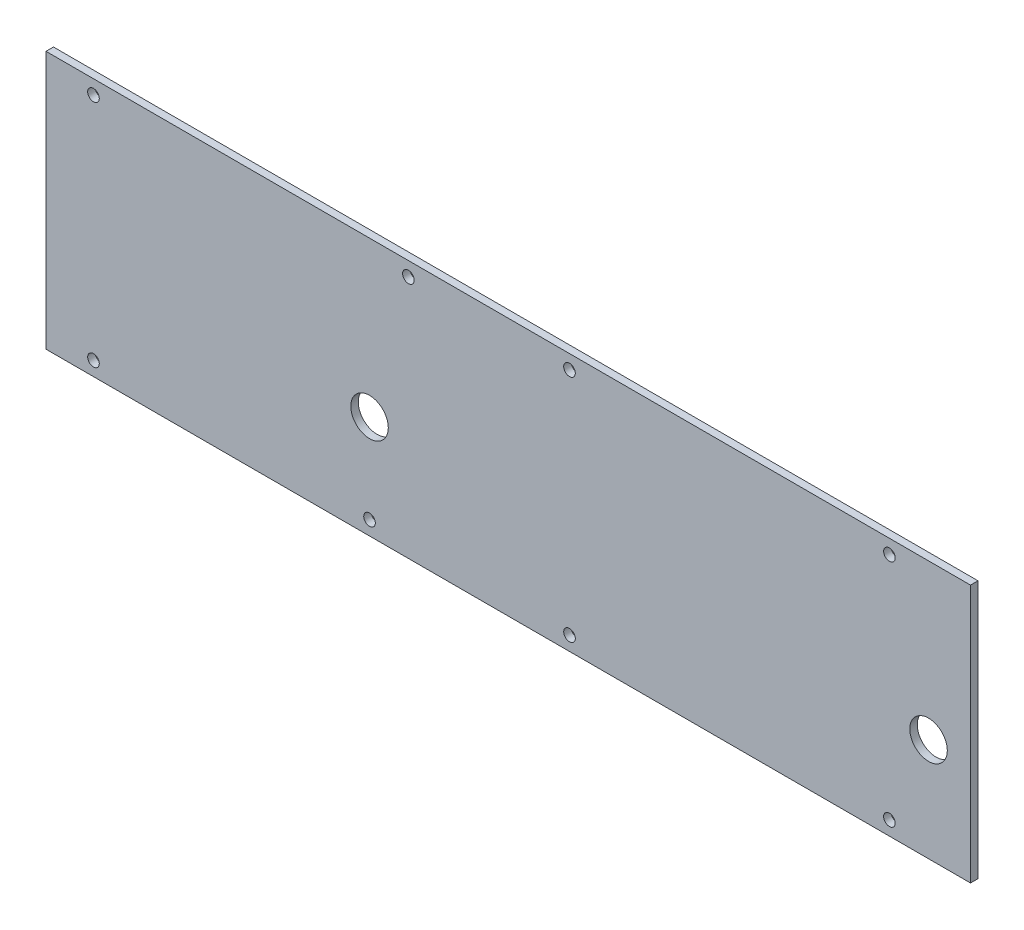
ISO-10303-21;
HEADER;
FILE_DESCRIPTION(('STEP AP214'),'2;1');
FILE_NAME('part.step','',(''),(''),'','','');
FILE_SCHEMA(('AUTOMOTIVE_DESIGN { 1 0 10303 214 1 1 1 1 }'));
ENDSEC;
DATA;
#1=APPLICATION_CONTEXT('core data for automotive mechanical design processes');
#2=APPLICATION_PROTOCOL_DEFINITION('international standard','automotive_design',2000,#1);
#3=PRODUCT_CONTEXT('',#1,'mechanical');
#4=PRODUCT('Part','Part','',(#3));
#5=PRODUCT_RELATED_PRODUCT_CATEGORY('part','',(#4));
#6=PRODUCT_DEFINITION_FORMATION('','',#4);
#7=PRODUCT_DEFINITION_CONTEXT('part definition',#1,'design');
#8=PRODUCT_DEFINITION('design','',#6,#7);
#9=PRODUCT_DEFINITION_SHAPE('','',#8);
#10=(LENGTH_UNIT() NAMED_UNIT(*) SI_UNIT(.MILLI.,.METRE.));
#11=(NAMED_UNIT(*) PLANE_ANGLE_UNIT() SI_UNIT($,.RADIAN.));
#12=(NAMED_UNIT(*) SI_UNIT($,.STERADIAN.) SOLID_ANGLE_UNIT());
#13=UNCERTAINTY_MEASURE_WITH_UNIT(LENGTH_MEASURE(1.E-05),#10,'distance_accuracy_value','');
#14=(GEOMETRIC_REPRESENTATION_CONTEXT(3) GLOBAL_UNCERTAINTY_ASSIGNED_CONTEXT((#13)) GLOBAL_UNIT_ASSIGNED_CONTEXT((#10,
#11,#12)) REPRESENTATION_CONTEXT('',''));
#15=CARTESIAN_POINT('',(0.,0.,0.));
#16=DIRECTION('',(0.,0.,1.));
#17=DIRECTION('',(1.,0.,0.));
#18=AXIS2_PLACEMENT_3D('',#15,#16,#17);
#19=CARTESIAN_POINT('',(136.525,38.1,-1.1049));
#20=DIRECTION('',(0.,1.,0.));
#21=DIRECTION('',(0.,0.,1.));
#22=AXIS2_PLACEMENT_3D('',#19,#20,#21);
#23=PLANE('',#22);
#24=DIRECTION('',(-1.,0.,0.));
#25=VECTOR('',#24,1.);
#26=CARTESIAN_POINT('',(136.525,38.1,1.1049));
#27=LINE('',#26,#25);
#28=CARTESIAN_POINT('',(136.525,38.1,1.1049));
#29=VERTEX_POINT('',#28);
#30=CARTESIAN_POINT('',(-136.525,38.1,1.1049));
#31=VERTEX_POINT('',#30);
#32=EDGE_CURVE('E97',#29,#31,#27,.T.);
#33=ORIENTED_EDGE('',*,*,#32,.F.);
#34=DIRECTION('',(0.,0.,1.));
#35=VECTOR('',#34,1.);
#36=CARTESIAN_POINT('',(136.525,38.1,-1.1049));
#37=LINE('',#36,#35);
#38=CARTESIAN_POINT('',(136.525,38.1,-1.1049));
#39=VERTEX_POINT('',#38);
#40=EDGE_CURVE('E11',#39,#29,#37,.T.);
#41=ORIENTED_EDGE('',*,*,#40,.F.);
#42=DIRECTION('',(-1.,0.,0.));
#43=VECTOR('',#42,1.);
#44=CARTESIAN_POINT('',(136.525,38.1,-1.1049));
#45=LINE('',#44,#43);
#46=CARTESIAN_POINT('',(-136.525,38.1,-1.1049));
#47=VERTEX_POINT('',#46);
#48=EDGE_CURVE('E90',#39,#47,#45,.T.);
#49=ORIENTED_EDGE('',*,*,#48,.T.);
#50=DIRECTION('',(0.,0.,1.));
#51=VECTOR('',#50,1.);
#52=CARTESIAN_POINT('',(-136.525,38.1,-1.1049));
#53=LINE('',#52,#51);
#54=EDGE_CURVE('E35',#47,#31,#53,.T.);
#55=ORIENTED_EDGE('',*,*,#54,.T.);
#56=EDGE_LOOP('',(#33,#41,#49,#55));
#57=FACE_BOUND('',#56,.T.);
#58=ADVANCED_FACE('F32',(#57),#23,.T.);
#59=CARTESIAN_POINT('',(136.525,-38.1,-1.1049));
#60=DIRECTION('',(1.,0.,0.));
#61=DIRECTION('',(0.,0.,-1.));
#62=AXIS2_PLACEMENT_3D('',#59,#60,#61);
#63=PLANE('',#62);
#64=DIRECTION('',(0.,1.,0.));
#65=VECTOR('',#64,1.);
#66=CARTESIAN_POINT('',(136.525,-38.1,1.1049));
#67=LINE('',#66,#65);
#68=CARTESIAN_POINT('',(136.525,-38.1,1.1049));
#69=VERTEX_POINT('',#68);
#70=EDGE_CURVE('E92',#69,#29,#67,.T.);
#71=ORIENTED_EDGE('',*,*,#70,.F.);
#72=DIRECTION('',(0.,0.,1.));
#73=VECTOR('',#72,1.);
#74=CARTESIAN_POINT('',(136.525,-38.1,-1.1049));
#75=LINE('',#74,#73);
#76=CARTESIAN_POINT('',(136.525,-38.1,-1.1049));
#77=VERTEX_POINT('',#76);
#78=EDGE_CURVE('E41',#77,#69,#75,.T.);
#79=ORIENTED_EDGE('',*,*,#78,.F.);
#80=DIRECTION('',(0.,1.,0.));
#81=VECTOR('',#80,1.);
#82=CARTESIAN_POINT('',(136.525,-38.1,-1.1049));
#83=LINE('',#82,#81);
#84=EDGE_CURVE('E87',#77,#39,#83,.T.);
#85=ORIENTED_EDGE('',*,*,#84,.T.);
#86=ORIENTED_EDGE('',*,*,#40,.T.);
#87=EDGE_LOOP('',(#71,#79,#85,#86));
#88=FACE_BOUND('',#87,.T.);
#89=ADVANCED_FACE('F108',(#88),#63,.T.);
#90=CARTESIAN_POINT('',(-136.525,-38.1,-1.1049));
#91=DIRECTION('',(0.,-1.,0.));
#92=DIRECTION('',(0.,0.,-1.));
#93=AXIS2_PLACEMENT_3D('',#90,#91,#92);
#94=PLANE('',#93);
#95=DIRECTION('',(1.,0.,0.));
#96=VECTOR('',#95,1.);
#97=CARTESIAN_POINT('',(-136.525,-38.1,1.1049));
#98=LINE('',#97,#96);
#99=CARTESIAN_POINT('',(-136.525,-38.1,1.1049));
#100=VERTEX_POINT('',#99);
#101=EDGE_CURVE('E82',#100,#69,#98,.T.);
#102=ORIENTED_EDGE('',*,*,#101,.F.);
#103=DIRECTION('',(0.,0.,1.));
#104=VECTOR('',#103,1.);
#105=CARTESIAN_POINT('',(-136.525,-38.1,-1.1049));
#106=LINE('',#105,#104);
#107=CARTESIAN_POINT('',(-136.525,-38.1,-1.1049));
#108=VERTEX_POINT('',#107);
#109=EDGE_CURVE('E77',#108,#100,#106,.T.);
#110=ORIENTED_EDGE('',*,*,#109,.F.);
#111=DIRECTION('',(1.,0.,0.));
#112=VECTOR('',#111,1.);
#113=CARTESIAN_POINT('',(-136.525,-38.1,-1.1049));
#114=LINE('',#113,#112);
#115=EDGE_CURVE('E80',#108,#77,#114,.T.);
#116=ORIENTED_EDGE('',*,*,#115,.T.);
#117=ORIENTED_EDGE('',*,*,#78,.T.);
#118=EDGE_LOOP('',(#102,#110,#116,#117));
#119=FACE_BOUND('',#118,.T.);
#120=ADVANCED_FACE('F79',(#119),#94,.T.);
#121=CARTESIAN_POINT('',(-136.525,38.1,-1.1049));
#122=DIRECTION('',(-1.,0.,0.));
#123=DIRECTION('',(0.,0.,1.));
#124=AXIS2_PLACEMENT_3D('',#121,#122,#123);
#125=PLANE('',#124);
#126=DIRECTION('',(0.,-1.,0.));
#127=VECTOR('',#126,1.);
#128=CARTESIAN_POINT('',(-136.525,38.1,1.1049));
#129=LINE('',#128,#127);
#130=EDGE_CURVE('E100',#31,#100,#129,.T.);
#131=ORIENTED_EDGE('',*,*,#130,.F.);
#132=ORIENTED_EDGE('',*,*,#54,.F.);
#133=DIRECTION('',(0.,-1.,0.));
#134=VECTOR('',#133,1.);
#135=CARTESIAN_POINT('',(-136.525,38.1,-1.1049));
#136=LINE('',#135,#134);
#137=EDGE_CURVE('E86',#47,#108,#136,.T.);
#138=ORIENTED_EDGE('',*,*,#137,.T.);
#139=ORIENTED_EDGE('',*,*,#109,.T.);
#140=EDGE_LOOP('',(#131,#132,#138,#139));
#141=FACE_BOUND('',#140,.T.);
#142=ADVANCED_FACE('F89',(#141),#125,.T.);
#143=CARTESIAN_POINT('',(-136.525,38.1,-1.1049));
#144=DIRECTION('',(0.,0.,1.));
#145=DIRECTION('',(1.,0.,0.));
#146=AXIS2_PLACEMENT_3D('',#143,#144,#145);
#147=PLANE('',#146);
#148=CARTESIAN_POINT('',(-40.9702,-7.65809999999999,-1.1049));
#149=DIRECTION('',(0.,0.,1.));
#150=DIRECTION('',(1.,0.,0.));
#151=AXIS2_PLACEMENT_3D('',#148,#149,#150);
#152=CIRCLE('',#151,5.53720000000002);
#153=CARTESIAN_POINT('',(-35.433,-7.65809999999999,-1.1049));
#154=VERTEX_POINT('',#153);
#155=EDGE_CURVE('E173',#154,#154,#152,.T.);
#156=ORIENTED_EDGE('',*,*,#155,.T.);
#157=EDGE_LOOP('',(#156));
#158=FACE_BOUND('',#157,.T.);
#159=CARTESIAN_POINT('',(124.1298,-7.6581,-1.1049));
#160=DIRECTION('',(0.,0.,1.));
#161=DIRECTION('',(1.,0.,0.));
#162=AXIS2_PLACEMENT_3D('',#159,#160,#161);
#163=CIRCLE('',#162,5.53720000000002);
#164=CARTESIAN_POINT('',(129.667,-7.6581,-1.1049));
#165=VERTEX_POINT('',#164);
#166=EDGE_CURVE('E183',#165,#165,#163,.T.);
#167=ORIENTED_EDGE('',*,*,#166,.T.);
#168=EDGE_LOOP('',(#167));
#169=FACE_BOUND('',#168,.T.);
#170=CARTESIAN_POINT('',(-40.9702,-33.9217,-1.1049));
#171=DIRECTION('',(0.,0.,1.));
#172=DIRECTION('',(1.,0.,0.));
#173=AXIS2_PLACEMENT_3D('',#170,#171,#172);
#174=CIRCLE('',#173,1.71450000000003);
#175=CARTESIAN_POINT('',(-39.2557,-33.9217,-1.1049));
#176=VERTEX_POINT('',#175);
#177=EDGE_CURVE('E189',#176,#176,#174,.T.);
#178=ORIENTED_EDGE('',*,*,#177,.T.);
#179=EDGE_LOOP('',(#178));
#180=FACE_BOUND('',#179,.T.);
#181=CARTESIAN_POINT('',(18.0848,33.9217,-1.1049));
#182=DIRECTION('',(0.,0.,1.));
#183=DIRECTION('',(1.,0.,0.));
#184=AXIS2_PLACEMENT_3D('',#181,#182,#183);
#185=CIRCLE('',#184,1.71450000000003);
#186=CARTESIAN_POINT('',(19.7993000000001,33.9217,-1.1049));
#187=VERTEX_POINT('',#186);
#188=EDGE_CURVE('E195',#187,#187,#185,.T.);
#189=ORIENTED_EDGE('',*,*,#188,.T.);
#190=EDGE_LOOP('',(#189));
#191=FACE_BOUND('',#190,.T.);
#192=CARTESIAN_POINT('',(-122.5042,-33.9217,-1.1049));
#193=DIRECTION('',(0.,0.,1.));
#194=DIRECTION('',(1.,0.,0.));
#195=AXIS2_PLACEMENT_3D('',#192,#193,#194);
#196=CIRCLE('',#195,1.71450000000002);
#197=CARTESIAN_POINT('',(-120.7897,-33.9217,-1.1049));
#198=VERTEX_POINT('',#197);
#199=EDGE_CURVE('E201',#198,#198,#196,.T.);
#200=ORIENTED_EDGE('',*,*,#199,.T.);
#201=EDGE_LOOP('',(#200));
#202=FACE_BOUND('',#201,.T.);
#203=CARTESIAN_POINT('',(-122.5042,33.9217,-1.1049));
#204=DIRECTION('',(0.,0.,1.));
#205=DIRECTION('',(1.,0.,0.));
#206=AXIS2_PLACEMENT_3D('',#203,#204,#205);
#207=CIRCLE('',#206,1.71450000000002);
#208=CARTESIAN_POINT('',(-120.7897,33.9217,-1.1049));
#209=VERTEX_POINT('',#208);
#210=EDGE_CURVE('E207',#209,#209,#207,.T.);
#211=ORIENTED_EDGE('',*,*,#210,.T.);
#212=EDGE_LOOP('',(#211));
#213=FACE_BOUND('',#212,.T.);
#214=CARTESIAN_POINT('',(-29.4894,33.9217,-1.1049));
#215=DIRECTION('',(0.,0.,1.));
#216=DIRECTION('',(1.,0.,0.));
#217=AXIS2_PLACEMENT_3D('',#214,#215,#216);
#218=CIRCLE('',#217,1.71450000000003);
#219=CARTESIAN_POINT('',(-27.7749,33.9217,-1.1049));
#220=VERTEX_POINT('',#219);
#221=EDGE_CURVE('E213',#220,#220,#218,.T.);
#222=ORIENTED_EDGE('',*,*,#221,.T.);
#223=EDGE_LOOP('',(#222));
#224=FACE_BOUND('',#223,.T.);
#225=CARTESIAN_POINT('',(112.5728,33.9217,-1.1049));
#226=DIRECTION('',(0.,0.,1.));
#227=DIRECTION('',(1.,0.,0.));
#228=AXIS2_PLACEMENT_3D('',#225,#226,#227);
#229=CIRCLE('',#228,1.71450000000002);
#230=CARTESIAN_POINT('',(114.2873,33.9217,-1.1049));
#231=VERTEX_POINT('',#230);
#232=EDGE_CURVE('E219',#231,#231,#229,.T.);
#233=ORIENTED_EDGE('',*,*,#232,.T.);
#234=EDGE_LOOP('',(#233));
#235=FACE_BOUND('',#234,.T.);
#236=CARTESIAN_POINT('',(18.0848,-33.9217,-1.1049));
#237=DIRECTION('',(0.,0.,1.));
#238=DIRECTION('',(1.,0.,0.));
#239=AXIS2_PLACEMENT_3D('',#236,#237,#238);
#240=CIRCLE('',#239,1.71450000000003);
#241=CARTESIAN_POINT('',(19.7993000000001,-33.9217,-1.1049));
#242=VERTEX_POINT('',#241);
#243=EDGE_CURVE('E225',#242,#242,#240,.T.);
#244=ORIENTED_EDGE('',*,*,#243,.T.);
#245=EDGE_LOOP('',(#244));
#246=FACE_BOUND('',#245,.T.);
#247=CARTESIAN_POINT('',(112.5728,-33.9217,-1.1049));
#248=DIRECTION('',(0.,0.,1.));
#249=DIRECTION('',(1.,0.,0.));
#250=AXIS2_PLACEMENT_3D('',#247,#248,#249);
#251=CIRCLE('',#250,1.71450000000002);
#252=CARTESIAN_POINT('',(114.2873,-33.9217,-1.1049));
#253=VERTEX_POINT('',#252);
#254=EDGE_CURVE('E101',#253,#253,#251,.T.);
#255=ORIENTED_EDGE('',*,*,#254,.T.);
#256=EDGE_LOOP('',(#255));
#257=FACE_BOUND('',#256,.T.);
#258=ORIENTED_EDGE('',*,*,#48,.F.);
#259=ORIENTED_EDGE('',*,*,#84,.F.);
#260=ORIENTED_EDGE('',*,*,#115,.F.);
#261=ORIENTED_EDGE('',*,*,#137,.F.);
#262=EDGE_LOOP('',(#258,#259,#260,#261));
#263=FACE_BOUND('',#262,.T.);
#264=ADVANCED_FACE('F85',(#158,#169,#180,#191,#202,#213,#224,#235,#246,#257,#263),#147,.F.);
#265=CARTESIAN_POINT('',(-136.525,38.1,1.1049));
#266=DIRECTION('',(0.,0.,1.));
#267=DIRECTION('',(1.,0.,0.));
#268=AXIS2_PLACEMENT_3D('',#265,#266,#267);
#269=PLANE('',#268);
#270=CARTESIAN_POINT('',(-40.9702,-7.65809999999999,1.1049));
#271=DIRECTION('',(0.,0.,1.));
#272=DIRECTION('',(1.,0.,0.));
#273=AXIS2_PLACEMENT_3D('',#270,#271,#272);
#274=CIRCLE('',#273,5.53720000000002);
#275=CARTESIAN_POINT('',(-35.433,-7.65809999999999,1.1049));
#276=VERTEX_POINT('',#275);
#277=EDGE_CURVE('E176',#276,#276,#274,.T.);
#278=ORIENTED_EDGE('',*,*,#277,.F.);
#279=EDGE_LOOP('',(#278));
#280=FACE_BOUND('',#279,.T.);
#281=CARTESIAN_POINT('',(124.1298,-7.6581,1.1049));
#282=DIRECTION('',(0.,0.,1.));
#283=DIRECTION('',(1.,0.,0.));
#284=AXIS2_PLACEMENT_3D('',#281,#282,#283);
#285=CIRCLE('',#284,5.53720000000002);
#286=CARTESIAN_POINT('',(129.667,-7.6581,1.1049));
#287=VERTEX_POINT('',#286);
#288=EDGE_CURVE('E178',#287,#287,#285,.T.);
#289=ORIENTED_EDGE('',*,*,#288,.F.);
#290=EDGE_LOOP('',(#289));
#291=FACE_BOUND('',#290,.T.);
#292=CARTESIAN_POINT('',(-40.9702,-33.9217,1.1049));
#293=DIRECTION('',(0.,0.,1.));
#294=DIRECTION('',(1.,0.,0.));
#295=AXIS2_PLACEMENT_3D('',#292,#293,#294);
#296=CIRCLE('',#295,1.71450000000003);
#297=CARTESIAN_POINT('',(-39.2557,-33.9217,1.1049));
#298=VERTEX_POINT('',#297);
#299=EDGE_CURVE('E186',#298,#298,#296,.T.);
#300=ORIENTED_EDGE('',*,*,#299,.F.);
#301=EDGE_LOOP('',(#300));
#302=FACE_BOUND('',#301,.T.);
#303=CARTESIAN_POINT('',(18.0848,33.9217,1.1049));
#304=DIRECTION('',(0.,0.,1.));
#305=DIRECTION('',(1.,0.,0.));
#306=AXIS2_PLACEMENT_3D('',#303,#304,#305);
#307=CIRCLE('',#306,1.71450000000003);
#308=CARTESIAN_POINT('',(19.7993000000001,33.9217,1.1049));
#309=VERTEX_POINT('',#308);
#310=EDGE_CURVE('E192',#309,#309,#307,.T.);
#311=ORIENTED_EDGE('',*,*,#310,.F.);
#312=EDGE_LOOP('',(#311));
#313=FACE_BOUND('',#312,.T.);
#314=CARTESIAN_POINT('',(-122.5042,-33.9217,1.1049));
#315=DIRECTION('',(0.,0.,1.));
#316=DIRECTION('',(1.,0.,0.));
#317=AXIS2_PLACEMENT_3D('',#314,#315,#316);
#318=CIRCLE('',#317,1.71450000000002);
#319=CARTESIAN_POINT('',(-120.7897,-33.9217,1.1049));
#320=VERTEX_POINT('',#319);
#321=EDGE_CURVE('E198',#320,#320,#318,.T.);
#322=ORIENTED_EDGE('',*,*,#321,.F.);
#323=EDGE_LOOP('',(#322));
#324=FACE_BOUND('',#323,.T.);
#325=CARTESIAN_POINT('',(-122.5042,33.9217,1.1049));
#326=DIRECTION('',(0.,0.,1.));
#327=DIRECTION('',(1.,0.,0.));
#328=AXIS2_PLACEMENT_3D('',#325,#326,#327);
#329=CIRCLE('',#328,1.71450000000002);
#330=CARTESIAN_POINT('',(-120.7897,33.9217,1.1049));
#331=VERTEX_POINT('',#330);
#332=EDGE_CURVE('E204',#331,#331,#329,.T.);
#333=ORIENTED_EDGE('',*,*,#332,.F.);
#334=EDGE_LOOP('',(#333));
#335=FACE_BOUND('',#334,.T.);
#336=CARTESIAN_POINT('',(-29.4894,33.9217,1.1049));
#337=DIRECTION('',(0.,0.,1.));
#338=DIRECTION('',(1.,0.,0.));
#339=AXIS2_PLACEMENT_3D('',#336,#337,#338);
#340=CIRCLE('',#339,1.71450000000003);
#341=CARTESIAN_POINT('',(-27.7749,33.9217,1.1049));
#342=VERTEX_POINT('',#341);
#343=EDGE_CURVE('E210',#342,#342,#340,.T.);
#344=ORIENTED_EDGE('',*,*,#343,.F.);
#345=EDGE_LOOP('',(#344));
#346=FACE_BOUND('',#345,.T.);
#347=CARTESIAN_POINT('',(112.5728,33.9217,1.1049));
#348=DIRECTION('',(0.,0.,1.));
#349=DIRECTION('',(1.,0.,0.));
#350=AXIS2_PLACEMENT_3D('',#347,#348,#349);
#351=CIRCLE('',#350,1.71450000000002);
#352=CARTESIAN_POINT('',(114.2873,33.9217,1.1049));
#353=VERTEX_POINT('',#352);
#354=EDGE_CURVE('E216',#353,#353,#351,.T.);
#355=ORIENTED_EDGE('',*,*,#354,.F.);
#356=EDGE_LOOP('',(#355));
#357=FACE_BOUND('',#356,.T.);
#358=CARTESIAN_POINT('',(18.0848,-33.9217,1.1049));
#359=DIRECTION('',(0.,0.,1.));
#360=DIRECTION('',(1.,0.,0.));
#361=AXIS2_PLACEMENT_3D('',#358,#359,#360);
#362=CIRCLE('',#361,1.71450000000003);
#363=CARTESIAN_POINT('',(19.7993000000001,-33.9217,1.1049));
#364=VERTEX_POINT('',#363);
#365=EDGE_CURVE('E222',#364,#364,#362,.T.);
#366=ORIENTED_EDGE('',*,*,#365,.F.);
#367=EDGE_LOOP('',(#366));
#368=FACE_BOUND('',#367,.T.);
#369=CARTESIAN_POINT('',(112.5728,-33.9217,1.1049));
#370=DIRECTION('',(0.,0.,1.));
#371=DIRECTION('',(1.,0.,0.));
#372=AXIS2_PLACEMENT_3D('',#369,#370,#371);
#373=CIRCLE('',#372,1.71450000000002);
#374=CARTESIAN_POINT('',(114.2873,-33.9217,1.1049));
#375=VERTEX_POINT('',#374);
#376=EDGE_CURVE('E228',#375,#375,#373,.T.);
#377=ORIENTED_EDGE('',*,*,#376,.F.);
#378=EDGE_LOOP('',(#377));
#379=FACE_BOUND('',#378,.T.);
#380=ORIENTED_EDGE('',*,*,#32,.T.);
#381=ORIENTED_EDGE('',*,*,#130,.T.);
#382=ORIENTED_EDGE('',*,*,#101,.T.);
#383=ORIENTED_EDGE('',*,*,#70,.T.);
#384=EDGE_LOOP('',(#380,#381,#382,#383));
#385=FACE_BOUND('',#384,.T.);
#386=ADVANCED_FACE('F107',(#280,#291,#302,#313,#324,#335,#346,#357,#368,#379,#385),#269,.T.);
#387=CARTESIAN_POINT('',(112.5728,-33.9217,1.1049));
#388=DIRECTION('',(0.,0.,1.));
#389=DIRECTION('',(1.,0.,0.));
#390=AXIS2_PLACEMENT_3D('',#387,#388,#389);
#391=CYLINDRICAL_SURFACE('',#390,1.71450000000002);
#392=ORIENTED_EDGE('',*,*,#254,.F.);
#393=EDGE_LOOP('',(#392));
#394=FACE_BOUND('',#393,.T.);
#395=ORIENTED_EDGE('',*,*,#376,.T.);
#396=EDGE_LOOP('',(#395));
#397=FACE_BOUND('',#396,.T.);
#398=ADVANCED_FACE('F126',(#394,#397),#391,.F.);
#399=CARTESIAN_POINT('',(18.0848,-33.9217,1.1049));
#400=DIRECTION('',(0.,0.,1.));
#401=DIRECTION('',(1.,0.,0.));
#402=AXIS2_PLACEMENT_3D('',#399,#400,#401);
#403=CYLINDRICAL_SURFACE('',#402,1.71450000000003);
#404=ORIENTED_EDGE('',*,*,#243,.F.);
#405=EDGE_LOOP('',(#404));
#406=FACE_BOUND('',#405,.T.);
#407=ORIENTED_EDGE('',*,*,#365,.T.);
#408=EDGE_LOOP('',(#407));
#409=FACE_BOUND('',#408,.T.);
#410=ADVANCED_FACE('F133',(#406,#409),#403,.F.);
#411=CARTESIAN_POINT('',(112.5728,33.9217,1.1049));
#412=DIRECTION('',(0.,0.,1.));
#413=DIRECTION('',(1.,0.,0.));
#414=AXIS2_PLACEMENT_3D('',#411,#412,#413);
#415=CYLINDRICAL_SURFACE('',#414,1.71450000000002);
#416=ORIENTED_EDGE('',*,*,#232,.F.);
#417=EDGE_LOOP('',(#416));
#418=FACE_BOUND('',#417,.T.);
#419=ORIENTED_EDGE('',*,*,#354,.T.);
#420=EDGE_LOOP('',(#419));
#421=FACE_BOUND('',#420,.T.);
#422=ADVANCED_FACE('F137',(#418,#421),#415,.F.);
#423=CARTESIAN_POINT('',(-29.4894,33.9217,1.1049));
#424=DIRECTION('',(0.,0.,1.));
#425=DIRECTION('',(1.,0.,0.));
#426=AXIS2_PLACEMENT_3D('',#423,#424,#425);
#427=CYLINDRICAL_SURFACE('',#426,1.71450000000003);
#428=ORIENTED_EDGE('',*,*,#221,.F.);
#429=EDGE_LOOP('',(#428));
#430=FACE_BOUND('',#429,.T.);
#431=ORIENTED_EDGE('',*,*,#343,.T.);
#432=EDGE_LOOP('',(#431));
#433=FACE_BOUND('',#432,.T.);
#434=ADVANCED_FACE('F141',(#430,#433),#427,.F.);
#435=CARTESIAN_POINT('',(-122.5042,33.9217,1.1049));
#436=DIRECTION('',(0.,0.,1.));
#437=DIRECTION('',(1.,0.,0.));
#438=AXIS2_PLACEMENT_3D('',#435,#436,#437);
#439=CYLINDRICAL_SURFACE('',#438,1.71450000000002);
#440=ORIENTED_EDGE('',*,*,#210,.F.);
#441=EDGE_LOOP('',(#440));
#442=FACE_BOUND('',#441,.T.);
#443=ORIENTED_EDGE('',*,*,#332,.T.);
#444=EDGE_LOOP('',(#443));
#445=FACE_BOUND('',#444,.T.);
#446=ADVANCED_FACE('F145',(#442,#445),#439,.F.);
#447=CARTESIAN_POINT('',(-122.5042,-33.9217,1.1049));
#448=DIRECTION('',(0.,0.,1.));
#449=DIRECTION('',(1.,0.,0.));
#450=AXIS2_PLACEMENT_3D('',#447,#448,#449);
#451=CYLINDRICAL_SURFACE('',#450,1.71450000000002);
#452=ORIENTED_EDGE('',*,*,#199,.F.);
#453=EDGE_LOOP('',(#452));
#454=FACE_BOUND('',#453,.T.);
#455=ORIENTED_EDGE('',*,*,#321,.T.);
#456=EDGE_LOOP('',(#455));
#457=FACE_BOUND('',#456,.T.);
#458=ADVANCED_FACE('F149',(#454,#457),#451,.F.);
#459=CARTESIAN_POINT('',(18.0848,33.9217,1.1049));
#460=DIRECTION('',(0.,0.,1.));
#461=DIRECTION('',(1.,0.,0.));
#462=AXIS2_PLACEMENT_3D('',#459,#460,#461);
#463=CYLINDRICAL_SURFACE('',#462,1.71450000000003);
#464=ORIENTED_EDGE('',*,*,#188,.F.);
#465=EDGE_LOOP('',(#464));
#466=FACE_BOUND('',#465,.T.);
#467=ORIENTED_EDGE('',*,*,#310,.T.);
#468=EDGE_LOOP('',(#467));
#469=FACE_BOUND('',#468,.T.);
#470=ADVANCED_FACE('F153',(#466,#469),#463,.F.);
#471=CARTESIAN_POINT('',(-40.9702,-33.9217,1.1049));
#472=DIRECTION('',(0.,0.,1.));
#473=DIRECTION('',(1.,0.,0.));
#474=AXIS2_PLACEMENT_3D('',#471,#472,#473);
#475=CYLINDRICAL_SURFACE('',#474,1.71450000000003);
#476=ORIENTED_EDGE('',*,*,#177,.F.);
#477=EDGE_LOOP('',(#476));
#478=FACE_BOUND('',#477,.T.);
#479=ORIENTED_EDGE('',*,*,#299,.T.);
#480=EDGE_LOOP('',(#479));
#481=FACE_BOUND('',#480,.T.);
#482=ADVANCED_FACE('F157',(#478,#481),#475,.F.);
#483=CARTESIAN_POINT('',(124.1298,-7.6581,1.1049));
#484=DIRECTION('',(0.,0.,1.));
#485=DIRECTION('',(1.,0.,0.));
#486=AXIS2_PLACEMENT_3D('',#483,#484,#485);
#487=CYLINDRICAL_SURFACE('',#486,5.53720000000002);
#488=ORIENTED_EDGE('',*,*,#166,.F.);
#489=EDGE_LOOP('',(#488));
#490=FACE_BOUND('',#489,.T.);
#491=ORIENTED_EDGE('',*,*,#288,.T.);
#492=EDGE_LOOP('',(#491));
#493=FACE_BOUND('',#492,.T.);
#494=ADVANCED_FACE('F161',(#490,#493),#487,.F.);
#495=CARTESIAN_POINT('',(-40.9702,-7.65809999999999,1.1049));
#496=DIRECTION('',(0.,0.,1.));
#497=DIRECTION('',(1.,0.,0.));
#498=AXIS2_PLACEMENT_3D('',#495,#496,#497);
#499=CYLINDRICAL_SURFACE('',#498,5.53720000000002);
#500=ORIENTED_EDGE('',*,*,#155,.F.);
#501=EDGE_LOOP('',(#500));
#502=FACE_BOUND('',#501,.T.);
#503=ORIENTED_EDGE('',*,*,#277,.T.);
#504=EDGE_LOOP('',(#503));
#505=FACE_BOUND('',#504,.T.);
#506=ADVANCED_FACE('F165',(#502,#505),#499,.F.);
#507=CLOSED_SHELL('',(#58,#89,#120,#142,#264,#386,#398,#410,#422,#434,#446,#458,#470,#482,#494,#506));
#508=MANIFOLD_SOLID_BREP('B2',#507);
#509=ADVANCED_BREP_SHAPE_REPRESENTATION('',(#18,#508),#14);
#510=SHAPE_DEFINITION_REPRESENTATION(#9,#509);
ENDSEC;
END-ISO-10303-21;
